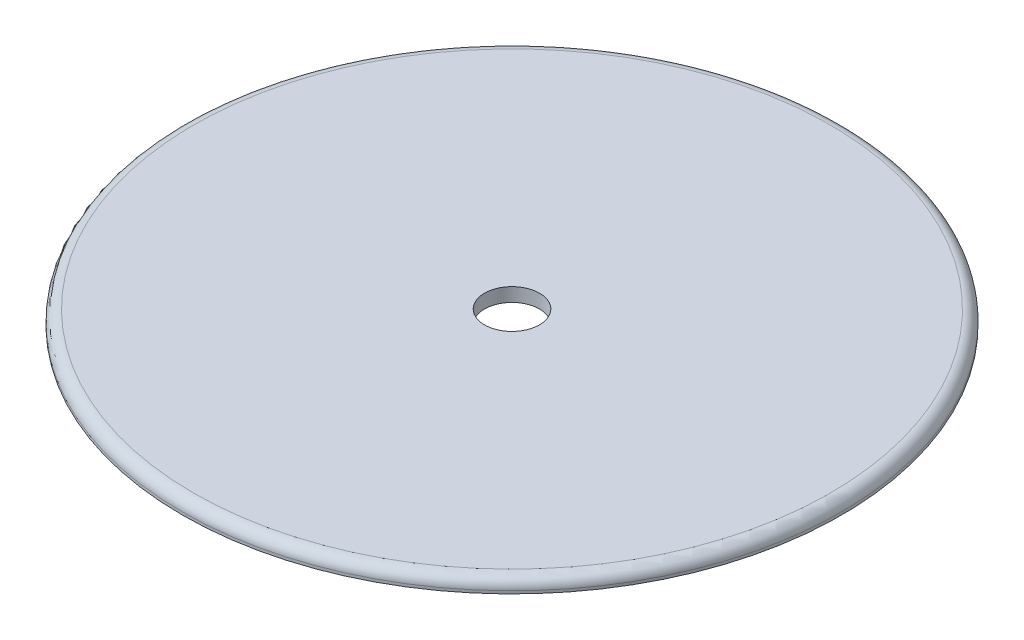
ISO-10303-21;
HEADER;
FILE_DESCRIPTION(('STEP AP214'),'2;1');
FILE_NAME('part.step','',(''),(''),'','','');
FILE_SCHEMA(('AUTOMOTIVE_DESIGN { 1 0 10303 214 1 1 1 1 }'));
ENDSEC;
DATA;
#1=APPLICATION_CONTEXT('core data for automotive mechanical design processes');
#2=APPLICATION_PROTOCOL_DEFINITION('international standard','automotive_design',2000,#1);
#3=PRODUCT_CONTEXT('',#1,'mechanical');
#4=PRODUCT('Part','Part','',(#3));
#5=PRODUCT_RELATED_PRODUCT_CATEGORY('part','',(#4));
#6=PRODUCT_DEFINITION_FORMATION('','',#4);
#7=PRODUCT_DEFINITION_CONTEXT('part definition',#1,'design');
#8=PRODUCT_DEFINITION('design','',#6,#7);
#9=PRODUCT_DEFINITION_SHAPE('','',#8);
#10=(LENGTH_UNIT() NAMED_UNIT(*) SI_UNIT(.MILLI.,.METRE.));
#11=(NAMED_UNIT(*) PLANE_ANGLE_UNIT() SI_UNIT($,.RADIAN.));
#12=(NAMED_UNIT(*) SI_UNIT($,.STERADIAN.) SOLID_ANGLE_UNIT());
#13=UNCERTAINTY_MEASURE_WITH_UNIT(LENGTH_MEASURE(1.E-05),#10,'distance_accuracy_value','');
#14=(GEOMETRIC_REPRESENTATION_CONTEXT(3) GLOBAL_UNCERTAINTY_ASSIGNED_CONTEXT((#13)) GLOBAL_UNIT_ASSIGNED_CONTEXT((#10,
#11,#12)) REPRESENTATION_CONTEXT('',''));
#15=CARTESIAN_POINT('',(0.,0.,0.));
#16=DIRECTION('',(0.,0.,1.));
#17=DIRECTION('',(1.,0.,0.));
#18=AXIS2_PLACEMENT_3D('',#15,#16,#17);
#19=CARTESIAN_POINT('',(0.,1.5875,0.));
#20=DIRECTION('',(0.,-1.,0.));
#21=DIRECTION('',(0.,0.,-1.));
#22=AXIS2_PLACEMENT_3D('',#19,#20,#21);
#23=CYLINDRICAL_SURFACE('',#22,38.1);
#24=CARTESIAN_POINT('',(0.,0.3175,0.));
#25=DIRECTION('',(0.,1.,0.));
#26=DIRECTION('',(0.,0.,1.));
#27=AXIS2_PLACEMENT_3D('',#24,#25,#26);
#28=CIRCLE('',#27,38.1);
#29=CARTESIAN_POINT('',(0.,0.3175,38.1));
#30=VERTEX_POINT('',#29);
#31=EDGE_CURVE('E10',#30,#30,#28,.F.);
#32=ORIENTED_EDGE('',*,*,#31,.T.);
#33=EDGE_LOOP('',(#32));
#34=FACE_BOUND('',#33,.T.);
#35=CARTESIAN_POINT('',(0.,0.,0.));
#36=DIRECTION('',(0.,1.,0.));
#37=DIRECTION('',(0.,0.,1.));
#38=AXIS2_PLACEMENT_3D('',#35,#36,#37);
#39=CIRCLE('',#38,38.1);
#40=CARTESIAN_POINT('',(0.,0.,38.1));
#41=VERTEX_POINT('',#40);
#42=EDGE_CURVE('E42',#41,#41,#39,.T.);
#43=ORIENTED_EDGE('',*,*,#42,.T.);
#44=EDGE_LOOP('',(#43));
#45=FACE_BOUND('',#44,.T.);
#46=ADVANCED_FACE('F31',(#34,#45),#23,.T.);
#47=CARTESIAN_POINT('',(0.,1.5875,0.));
#48=DIRECTION('',(0.,1.,0.));
#49=DIRECTION('',(0.,0.,1.));
#50=AXIS2_PLACEMENT_3D('',#47,#48,#49);
#51=PLANE('',#50);
#52=CARTESIAN_POINT('',(0.,1.5875,0.));
#53=DIRECTION('',(0.,-1.,0.));
#54=DIRECTION('',(0.,0.,-1.));
#55=AXIS2_PLACEMENT_3D('',#52,#53,#54);
#56=CIRCLE('',#55,3.175);
#57=CARTESIAN_POINT('',(0.,1.5875,-3.175));
#58=VERTEX_POINT('',#57);
#59=EDGE_CURVE('E46',#58,#58,#56,.T.);
#60=ORIENTED_EDGE('',*,*,#59,.T.);
#61=EDGE_LOOP('',(#60));
#62=FACE_BOUND('',#61,.T.);
#63=CARTESIAN_POINT('',(0.,1.5875,0.));
#64=DIRECTION('',(0.,1.,0.));
#65=DIRECTION('',(0.,0.,1.));
#66=AXIS2_PLACEMENT_3D('',#63,#64,#65);
#67=CIRCLE('',#66,36.83);
#68=CARTESIAN_POINT('',(0.,1.5875,36.83));
#69=VERTEX_POINT('',#68);
#70=EDGE_CURVE('E38',#69,#69,#67,.T.);
#71=ORIENTED_EDGE('',*,*,#70,.T.);
#72=EDGE_LOOP('',(#71));
#73=FACE_BOUND('',#72,.T.);
#74=ADVANCED_FACE('F55',(#62,#73),#51,.T.);
#75=CARTESIAN_POINT('',(0.,0.,0.));
#76=DIRECTION('',(0.,1.,0.));
#77=DIRECTION('',(0.,0.,1.));
#78=AXIS2_PLACEMENT_3D('',#75,#76,#77);
#79=PLANE('',#78);
#80=CARTESIAN_POINT('',(0.,0.,0.));
#81=DIRECTION('',(0.,-1.,0.));
#82=DIRECTION('',(0.,0.,-1.));
#83=AXIS2_PLACEMENT_3D('',#80,#81,#82);
#84=CIRCLE('',#83,3.175);
#85=CARTESIAN_POINT('',(0.,0.,-3.175));
#86=VERTEX_POINT('',#85);
#87=EDGE_CURVE('E49',#86,#86,#84,.T.);
#88=ORIENTED_EDGE('',*,*,#87,.F.);
#89=EDGE_LOOP('',(#88));
#90=FACE_BOUND('',#89,.T.);
#91=ORIENTED_EDGE('',*,*,#42,.F.);
#92=EDGE_LOOP('',(#91));
#93=FACE_BOUND('',#92,.T.);
#94=ADVANCED_FACE('F63',(#90,#93),#79,.F.);
#95=CARTESIAN_POINT('',(0.,0.3175,0.));
#96=DIRECTION('',(0.,1.,0.));
#97=DIRECTION('',(0.,0.,1.));
#98=AXIS2_PLACEMENT_3D('',#95,#96,#97);
#99=TOROIDAL_SURFACE('',#98,36.83,1.27);
#100=ORIENTED_EDGE('',*,*,#31,.F.);
#101=EDGE_LOOP('',(#100));
#102=FACE_BOUND('',#101,.T.);
#103=ORIENTED_EDGE('',*,*,#70,.F.);
#104=EDGE_LOOP('',(#103));
#105=FACE_BOUND('',#104,.T.);
#106=ADVANCED_FACE('F33',(#102,#105),#99,.T.);
#107=CARTESIAN_POINT('',(0.,1.5875,0.));
#108=DIRECTION('',(0.,-1.,0.));
#109=DIRECTION('',(0.,0.,-1.));
#110=AXIS2_PLACEMENT_3D('',#107,#108,#109);
#111=CYLINDRICAL_SURFACE('',#110,3.175);
#112=ORIENTED_EDGE('',*,*,#59,.F.);
#113=EDGE_LOOP('',(#112));
#114=FACE_BOUND('',#113,.T.);
#115=ORIENTED_EDGE('',*,*,#87,.T.);
#116=EDGE_LOOP('',(#115));
#117=FACE_BOUND('',#116,.T.);
#118=ADVANCED_FACE('F57',(#114,#117),#111,.F.);
#119=CLOSED_SHELL('',(#46,#74,#94,#106,#118));
#120=MANIFOLD_SOLID_BREP('B2',#119);
#121=ADVANCED_BREP_SHAPE_REPRESENTATION('',(#18,#120),#14);
#122=SHAPE_DEFINITION_REPRESENTATION(#9,#121);
ENDSEC;
END-ISO-10303-21;
